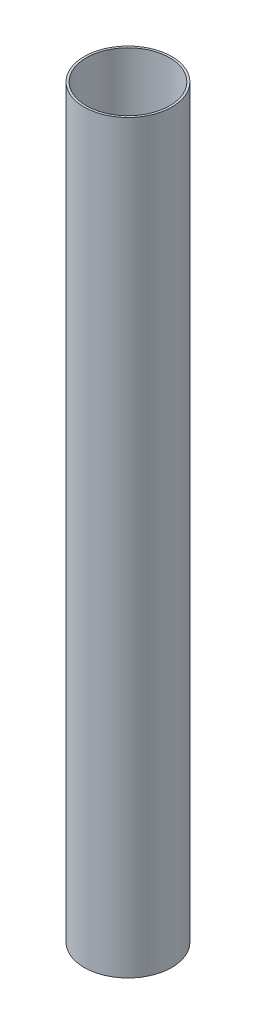
ISO-10303-21;
HEADER;
FILE_DESCRIPTION(('STEP AP214'),'2;1');
FILE_NAME('part.step','',(''),(''),'','','');
FILE_SCHEMA(('AUTOMOTIVE_DESIGN { 1 0 10303 214 1 1 1 1 }'));
ENDSEC;
DATA;
#1=APPLICATION_CONTEXT('core data for automotive mechanical design processes');
#2=APPLICATION_PROTOCOL_DEFINITION('international standard','automotive_design',2000,#1);
#3=PRODUCT_CONTEXT('',#1,'mechanical');
#4=PRODUCT('Part','Part','',(#3));
#5=PRODUCT_RELATED_PRODUCT_CATEGORY('part','',(#4));
#6=PRODUCT_DEFINITION_FORMATION('','',#4);
#7=PRODUCT_DEFINITION_CONTEXT('part definition',#1,'design');
#8=PRODUCT_DEFINITION('design','',#6,#7);
#9=PRODUCT_DEFINITION_SHAPE('','',#8);
#10=(LENGTH_UNIT() NAMED_UNIT(*) SI_UNIT(.MILLI.,.METRE.));
#11=(NAMED_UNIT(*) PLANE_ANGLE_UNIT() SI_UNIT($,.RADIAN.));
#12=(NAMED_UNIT(*) SI_UNIT($,.STERADIAN.) SOLID_ANGLE_UNIT());
#13=UNCERTAINTY_MEASURE_WITH_UNIT(LENGTH_MEASURE(1.E-05),#10,'distance_accuracy_value','');
#14=(GEOMETRIC_REPRESENTATION_CONTEXT(3) GLOBAL_UNCERTAINTY_ASSIGNED_CONTEXT((#13)) GLOBAL_UNIT_ASSIGNED_CONTEXT((#10,
#11,#12)) REPRESENTATION_CONTEXT('',''));
#15=CARTESIAN_POINT('',(0.,0.,0.));
#16=DIRECTION('',(0.,0.,1.));
#17=DIRECTION('',(1.,0.,0.));
#18=AXIS2_PLACEMENT_3D('',#15,#16,#17);
#19=CARTESIAN_POINT('',(0.,700.,0.));
#20=DIRECTION('',(0.,1.,0.));
#21=DIRECTION('',(0.,0.,1.));
#22=AXIS2_PLACEMENT_3D('',#19,#20,#21);
#23=PLANE('',#22);
#24=CARTESIAN_POINT('',(0.,700.,0.));
#25=DIRECTION('',(0.,1.,0.));
#26=DIRECTION('',(0.,0.,1.));
#27=AXIS2_PLACEMENT_3D('',#24,#25,#26);
#28=CIRCLE('',#27,41.15);
#29=CARTESIAN_POINT('',(0.,700.,41.15));
#30=VERTEX_POINT('',#29);
#31=EDGE_CURVE('E10',#30,#30,#28,.T.);
#32=ORIENTED_EDGE('',*,*,#31,.T.);
#33=EDGE_LOOP('',(#32));
#34=FACE_BOUND('',#33,.T.);
#35=CARTESIAN_POINT('',(0.,700.,0.));
#36=DIRECTION('',(0.,1.,0.));
#37=DIRECTION('',(0.,0.,1.));
#38=AXIS2_PLACEMENT_3D('',#35,#36,#37);
#39=CIRCLE('',#38,39.15);
#40=CARTESIAN_POINT('',(0.,700.,39.15));
#41=VERTEX_POINT('',#40);
#42=EDGE_CURVE('E56',#41,#41,#39,.T.);
#43=ORIENTED_EDGE('',*,*,#42,.F.);
#44=EDGE_LOOP('',(#43));
#45=FACE_BOUND('',#44,.T.);
#46=ADVANCED_FACE('F43',(#34,#45),#23,.T.);
#47=CARTESIAN_POINT('',(0.,0.,0.));
#48=DIRECTION('',(0.,1.,0.));
#49=DIRECTION('',(0.,0.,1.));
#50=AXIS2_PLACEMENT_3D('',#47,#48,#49);
#51=PLANE('',#50);
#52=CARTESIAN_POINT('',(0.,0.,0.));
#53=DIRECTION('',(0.,1.,0.));
#54=DIRECTION('',(0.,0.,1.));
#55=AXIS2_PLACEMENT_3D('',#52,#53,#54);
#56=CIRCLE('',#55,41.15);
#57=CARTESIAN_POINT('',(0.,0.,41.15));
#58=VERTEX_POINT('',#57);
#59=EDGE_CURVE('E47',#58,#58,#56,.T.);
#60=ORIENTED_EDGE('',*,*,#59,.F.);
#61=EDGE_LOOP('',(#60));
#62=FACE_BOUND('',#61,.T.);
#63=CARTESIAN_POINT('',(0.,0.,0.));
#64=DIRECTION('',(0.,1.,0.));
#65=DIRECTION('',(0.,0.,1.));
#66=AXIS2_PLACEMENT_3D('',#63,#64,#65);
#67=CIRCLE('',#66,39.15);
#68=CARTESIAN_POINT('',(0.,0.,39.15));
#69=VERTEX_POINT('',#68);
#70=EDGE_CURVE('E58',#69,#69,#67,.T.);
#71=ORIENTED_EDGE('',*,*,#70,.T.);
#72=EDGE_LOOP('',(#71));
#73=FACE_BOUND('',#72,.T.);
#74=ADVANCED_FACE('F70',(#62,#73),#51,.F.);
#75=CARTESIAN_POINT('',(0.,700.,0.));
#76=DIRECTION('',(0.,-1.,0.));
#77=DIRECTION('',(0.,0.,-1.));
#78=AXIS2_PLACEMENT_3D('',#75,#76,#77);
#79=CYLINDRICAL_SURFACE('',#78,41.15);
#80=ORIENTED_EDGE('',*,*,#31,.F.);
#81=EDGE_LOOP('',(#80));
#82=FACE_BOUND('',#81,.T.);
#83=ORIENTED_EDGE('',*,*,#59,.T.);
#84=EDGE_LOOP('',(#83));
#85=FACE_BOUND('',#84,.T.);
#86=ADVANCED_FACE('F45',(#82,#85),#79,.T.);
#87=CARTESIAN_POINT('',(0.,700.,0.));
#88=DIRECTION('',(0.,-1.,0.));
#89=DIRECTION('',(0.,0.,-1.));
#90=AXIS2_PLACEMENT_3D('',#87,#88,#89);
#91=CYLINDRICAL_SURFACE('',#90,39.15);
#92=ORIENTED_EDGE('',*,*,#42,.T.);
#93=EDGE_LOOP('',(#92));
#94=FACE_BOUND('',#93,.T.);
#95=ORIENTED_EDGE('',*,*,#70,.F.);
#96=EDGE_LOOP('',(#95));
#97=FACE_BOUND('',#96,.T.);
#98=ADVANCED_FACE('F66',(#94,#97),#91,.F.);
#99=CLOSED_SHELL('',(#46,#74,#86,#98));
#100=MANIFOLD_SOLID_BREP('B2',#99);
#101=ADVANCED_BREP_SHAPE_REPRESENTATION('',(#18,#100),#14);
#102=SHAPE_DEFINITION_REPRESENTATION(#9,#101);
ENDSEC;
END-ISO-10303-21;
